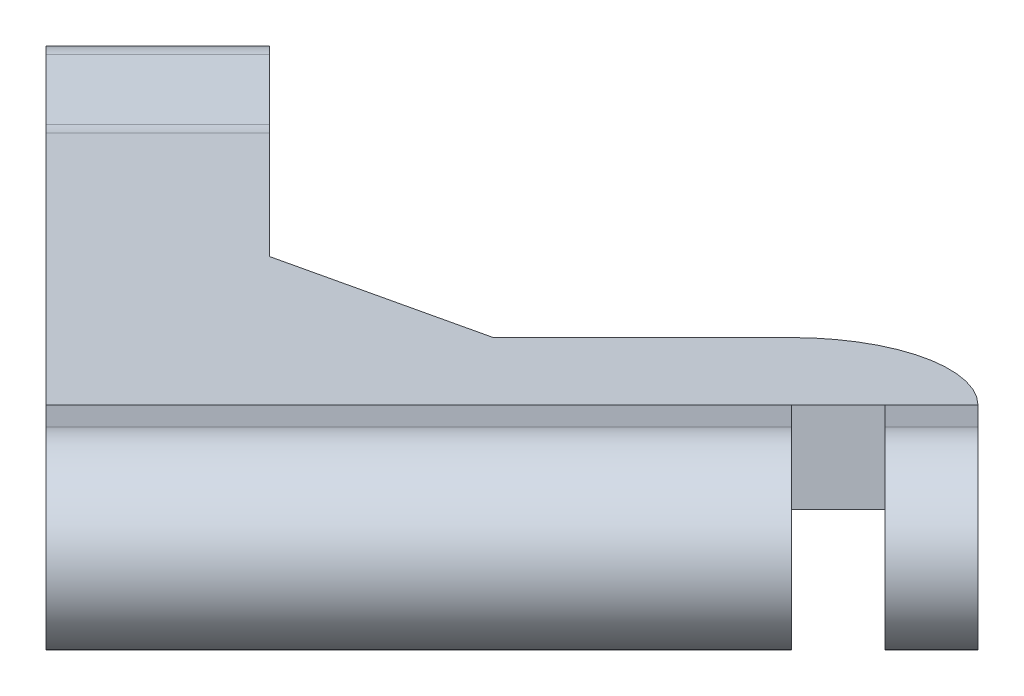
ISO-10303-21;
HEADER;
FILE_DESCRIPTION(('STEP AP214'),'2;1');
FILE_NAME('part.step','',(''),(''),'','','');
FILE_SCHEMA(('AUTOMOTIVE_DESIGN { 1 0 10303 214 1 1 1 1 }'));
ENDSEC;
DATA;
#1=APPLICATION_CONTEXT('core data for automotive mechanical design processes');
#2=APPLICATION_PROTOCOL_DEFINITION('international standard','automotive_design',2000,#1);
#3=PRODUCT_CONTEXT('',#1,'mechanical');
#4=PRODUCT('Part','Part','',(#3));
#5=PRODUCT_RELATED_PRODUCT_CATEGORY('part','',(#4));
#6=PRODUCT_DEFINITION_FORMATION('','',#4);
#7=PRODUCT_DEFINITION_CONTEXT('part definition',#1,'design');
#8=PRODUCT_DEFINITION('design','',#6,#7);
#9=PRODUCT_DEFINITION_SHAPE('','',#8);
#10=(LENGTH_UNIT() NAMED_UNIT(*) SI_UNIT(.MILLI.,.METRE.));
#11=(NAMED_UNIT(*) PLANE_ANGLE_UNIT() SI_UNIT($,.RADIAN.));
#12=(NAMED_UNIT(*) SI_UNIT($,.STERADIAN.) SOLID_ANGLE_UNIT());
#13=UNCERTAINTY_MEASURE_WITH_UNIT(LENGTH_MEASURE(1.E-05),#10,'distance_accuracy_value','');
#14=(GEOMETRIC_REPRESENTATION_CONTEXT(3) GLOBAL_UNCERTAINTY_ASSIGNED_CONTEXT((#13)) GLOBAL_UNIT_ASSIGNED_CONTEXT((#10,
#11,#12)) REPRESENTATION_CONTEXT('',''));
#15=CARTESIAN_POINT('',(0.,0.,0.));
#16=DIRECTION('',(0.,0.,1.));
#17=DIRECTION('',(1.,0.,0.));
#18=AXIS2_PLACEMENT_3D('',#15,#16,#17);
#19=CARTESIAN_POINT('',(7.47352792181047,9.75,60.017683798911));
#20=DIRECTION('',(0.707106781186551,0.,-0.707106781186544));
#21=DIRECTION('',(-0.707106781186544,0.,-0.707106781186551));
#22=AXIS2_PLACEMENT_3D('',#19,#20,#21);
#23=PLANE('',#22);
#24=CARTESIAN_POINT('',(7.47352792181047,9.75,60.017683798911));
#25=DIRECTION('',(0.707106781186551,0.,-0.707106781186544));
#26=DIRECTION('',(-0.707106781186544,0.,-0.707106781186551));
#27=AXIS2_PLACEMENT_3D('',#24,#25,#26);
#28=CIRCLE('',#27,1.);
#29=CARTESIAN_POINT('',(6.76642114062393,9.75,59.3105770177244));
#30=VERTEX_POINT('',#29);
#31=EDGE_CURVE('E277',#30,#30,#28,.T.);
#32=ORIENTED_EDGE('',*,*,#31,.F.);
#33=EDGE_LOOP('',(#32));
#34=FACE_BOUND('',#33,.T.);
#35=DIRECTION('',(0.70700675028775,-0.0168199314832323,0.707006750287757));
#36=VECTOR('',#35,1.);
#37=CARTESIAN_POINT('',(-26.1822663292059,7.55025835734501,26.3618895480781));
#38=LINE('',#37,#36);
#39=CARTESIAN_POINT('',(3.61958859566675,6.84126207448712,56.1637444727672));
#40=VERTEX_POINT('',#39);
#41=CARTESIAN_POINT('',(7.43784745899505,6.75042439516078,59.9820033360956));
#42=VERTEX_POINT('',#41);
#43=EDGE_CURVE('E274',#40,#42,#38,.T.);
#44=ORIENTED_EDGE('',*,*,#43,.F.);
#45=DIRECTION('',(-0.171498585142516,0.970142500145329,-0.171498585142518));
#46=VECTOR('',#45,1.);
#47=CARTESIAN_POINT('',(3.36234071795176,8.29647582471199,55.9064965950522));
#48=LINE('',#47,#46);
#49=CARTESIAN_POINT('',(3.1050928401906,9.75168957493467,55.6492487174748));
#50=VERTEX_POINT('',#49);
#51=EDGE_CURVE('E285',#40,#50,#48,.T.);
#52=ORIENTED_EDGE('',*,*,#51,.T.);
#53=DIRECTION('',(0.618232550201715,0.485362779518743,0.618232550201721));
#54=VECTOR('',#53,1.);
#55=CARTESIAN_POINT('',(-22.2776522712156,-10.1758275301328,30.2665036060684));
#56=LINE('',#55,#54);
#57=CARTESIAN_POINT('',(6.44391798351243,12.3729385716022,58.9880738607967));
#58=VERTEX_POINT('',#57);
#59=EDGE_CURVE('E267',#50,#58,#56,.T.);
#60=ORIENTED_EDGE('',*,*,#59,.T.);
#61=CARTESIAN_POINT('',(7.47352792181047,9.75,60.017683798911));
#62=DIRECTION('',(0.707106781186551,0.,-0.707106781186544));
#63=DIRECTION('',(-0.707106781186544,0.,-0.707106781186551));
#64=AXIS2_PLACEMENT_3D('',#61,#62,#63);
#65=CIRCLE('',#64,3.);
#66=EDGE_CURVE('E271',#58,#42,#65,.T.);
#67=ORIENTED_EDGE('',*,*,#66,.T.);
#68=EDGE_LOOP('',(#44,#52,#60,#67));
#69=FACE_BOUND('',#68,.T.);
#70=ADVANCED_FACE('F41',(#34,#69),#23,.T.);
#71=CARTESIAN_POINT('',(-36.1715728752538,0.,36.1715728752534));
#72=DIRECTION('',(0.707106781186551,0.,-0.707106781186544));
#73=DIRECTION('',(-0.707106781186544,0.,-0.707106781186551));
#74=AXIS2_PLACEMENT_3D('',#71,#72,#73);
#75=PLANE('',#74);
#76=CARTESIAN_POINT('',(-23.6391704504667,2.25,48.7039753000407));
#77=DIRECTION('',(0.707106781186551,0.,-0.707106781186544));
#78=DIRECTION('',(-0.707106781186544,0.,-0.707106781186551));
#79=AXIS2_PLACEMENT_3D('',#76,#77,#78);
#80=CIRCLE('',#79,1.);
#81=CARTESIAN_POINT('',(-24.3462772316533,2.25,47.9968685188541));
#82=VERTEX_POINT('',#81);
#83=EDGE_CURVE('E262',#82,#82,#80,.T.);
#84=ORIENTED_EDGE('',*,*,#83,.F.);
#85=EDGE_LOOP('',(#84));
#86=FACE_BOUND('',#85,.T.);
#87=DIRECTION('',(-0.685994340570032,-0.242535625036333,-0.685994340570039));
#88=VECTOR('',#87,1.);
#89=CARTESIAN_POINT('',(-36.0659712591965,-0.597372950547049,36.2771744913108));
#90=LINE('',#89,#88);
#91=CARTESIAN_POINT('',(-14.3403398426737,7.08379769954436,58.0028059078338));
#92=VERTEX_POINT('',#91);
#93=CARTESIAN_POINT('',(-20.615798453103,4.86508803029933,51.7273472974044));
#94=VERTEX_POINT('',#93);
#95=EDGE_CURVE('E251',#92,#94,#90,.T.);
#96=ORIENTED_EDGE('',*,*,#95,.F.);
#97=DIRECTION('',(0.171498585142508,-0.970142500145332,0.17149858514251));
#98=VECTOR('',#97,1.);
#99=CARTESIAN_POINT('',(-14.445941458731,7.68117065009143,57.8972042917764));
#100=LINE('',#99,#98);
#101=CARTESIAN_POINT('',(-13.8258440872462,4.17337019910837,58.5173016632613));
#102=VERTEX_POINT('',#101);
#103=EDGE_CURVE('E187',#92,#102,#100,.T.);
#104=ORIENTED_EDGE('',*,*,#103,.T.);
#105=DIRECTION('',(-0.685994340570032,-0.242535625036333,-0.685994340570039));
#106=VECTOR('',#105,1.);
#107=CARTESIAN_POINT('',(-35.551475503769,-3.50780045098305,36.7916702467383));
#108=LINE('',#107,#106);
#109=CARTESIAN_POINT('',(-20.8107433257205,1.70383539039338,51.5324024247869));
#110=VERTEX_POINT('',#109);
#111=EDGE_CURVE('E249',#102,#110,#108,.T.);
#112=ORIENTED_EDGE('',*,*,#111,.T.);
#113=DIRECTION('',(-0.655981688195146,-0.373331018675496,-0.655981688195153));
#114=VECTOR('',#113,1.);
#115=CARTESIAN_POINT('',(-34.4479075463554,-6.05732090703683,37.8952382041519));
#116=LINE('',#115,#114);
#117=CARTESIAN_POINT('',(-23.1112006606012,0.394603599772046,49.2319450899061));
#118=VERTEX_POINT('',#117);
#119=EDGE_CURVE('E246',#110,#118,#116,.T.);
#120=ORIENTED_EDGE('',*,*,#119,.T.);
#121=CARTESIAN_POINT('',(-23.6391704504667,2.25,48.7039753000407));
#122=DIRECTION('',(0.707106781186551,0.,-0.707106781186544));
#123=DIRECTION('',(-0.707106781186544,0.,-0.707106781186551));
#124=AXIS2_PLACEMENT_3D('',#121,#122,#123);
#125=CIRCLE('',#124,2.);
#126=CARTESIAN_POINT('',(-23.8245050536997,4.23275116181758,48.5186406968077));
#127=VERTEX_POINT('',#126);
#128=EDGE_CURVE('E259',#118,#127,#125,.T.);
#129=ORIENTED_EDGE('',*,*,#128,.T.);
#130=DIRECTION('',(-0.701008395963355,-0.131051354734543,-0.701008395963362));
#131=VECTOR('',#130,1.);
#132=CARTESIAN_POINT('',(-36.3483734896303,1.89145263458614,35.994772260877));
#133=LINE('',#132,#131);
#134=CARTESIAN_POINT('',(-21.0099548707332,4.75892262648203,51.3331908797743));
#135=VERTEX_POINT('',#134);
#136=EDGE_CURVE('E256',#135,#127,#133,.T.);
#137=ORIENTED_EDGE('',*,*,#136,.F.);
#138=CARTESIAN_POINT('',(-21.4732913788155,9.71580053102599,50.8698543716919));
#139=DIRECTION('',(0.707106781186551,0.,-0.707106781186544));
#140=DIRECTION('',(-0.707106781186544,0.,-0.707106781186551));
#141=AXIS2_PLACEMENT_3D('',#138,#139,#140);
#142=CIRCLE('',#141,5.);
#143=EDGE_CURVE('E253',#94,#135,#142,.T.);
#144=ORIENTED_EDGE('',*,*,#143,.F.);
#145=EDGE_LOOP('',(#96,#104,#112,#120,#129,#137,#144));
#146=FACE_BOUND('',#145,.T.);
#147=ADVANCED_FACE('F328',(#86,#146),#75,.T.);
#148=CARTESIAN_POINT('',(-27.881811137586,2.25,52.94661598716));
#149=DIRECTION('',(0.707106781186551,0.,-0.707106781186544));
#150=DIRECTION('',(-0.707106781186544,0.,-0.707106781186551));
#151=AXIS2_PLACEMENT_3D('',#148,#149,#150);
#152=CYLINDRICAL_SURFACE('',#151,2.);
#153=DIRECTION('',(0.707106781186551,0.,-0.707106781186544));
#154=VECTOR('',#153,1.);
#155=CARTESIAN_POINT('',(-28.067145740819,4.23275116181758,52.761281383927));
#156=LINE('',#155,#154);
#157=CARTESIAN_POINT('',(-28.067145740819,4.23275116181758,52.761281383927));
#158=VERTEX_POINT('',#157);
#159=EDGE_CURVE('E193',#158,#127,#156,.T.);
#160=ORIENTED_EDGE('',*,*,#159,.T.);
#161=ORIENTED_EDGE('',*,*,#128,.F.);
#162=DIRECTION('',(0.707106781186551,0.,-0.707106781186544));
#163=VECTOR('',#162,1.);
#164=CARTESIAN_POINT('',(-27.3538413477206,0.394603599772046,53.4745857770254));
#165=LINE('',#164,#163);
#166=CARTESIAN_POINT('',(-27.3538413477206,0.394603599772046,53.4745857770254));
#167=VERTEX_POINT('',#166);
#168=EDGE_CURVE('E192',#167,#118,#165,.T.);
#169=ORIENTED_EDGE('',*,*,#168,.F.);
#170=CARTESIAN_POINT('',(-27.881811137586,2.25,52.94661598716));
#171=DIRECTION('',(0.707106781186551,0.,-0.707106781186544));
#172=DIRECTION('',(-0.707106781186544,0.,-0.707106781186551));
#173=AXIS2_PLACEMENT_3D('',#170,#171,#172);
#174=CIRCLE('',#173,2.);
#175=EDGE_CURVE('E237',#167,#158,#174,.T.);
#176=ORIENTED_EDGE('',*,*,#175,.T.);
#177=EDGE_LOOP('',(#160,#161,#169,#176));
#178=FACE_BOUND('',#177,.T.);
#179=ADVANCED_FACE('F334',(#178),#152,.T.);
#180=CARTESIAN_POINT('',(-38.6905482334747,-6.05732090703683,42.1378788912711));
#181=DIRECTION('',(0.263984894932724,-0.927698200113979,0.263984894932726));
#182=DIRECTION('',(0.,-0.273693681767347,-0.961816910103287));
#183=AXIS2_PLACEMENT_3D('',#180,#181,#182);
#184=PLANE('',#183);
#185=ORIENTED_EDGE('',*,*,#168,.T.);
#186=ORIENTED_EDGE('',*,*,#119,.F.);
#187=DIRECTION('',(0.707106781186551,0.,-0.707106781186544));
#188=VECTOR('',#187,1.);
#189=CARTESIAN_POINT('',(-25.0533840128398,1.70383539039338,55.7750431119062));
#190=LINE('',#189,#188);
#191=CARTESIAN_POINT('',(-25.0533840128398,1.70383539039338,55.7750431119062));
#192=VERTEX_POINT('',#191);
#193=EDGE_CURVE('E211',#192,#110,#190,.T.);
#194=ORIENTED_EDGE('',*,*,#193,.F.);
#195=DIRECTION('',(-0.655981688195146,-0.373331018675496,-0.655981688195153));
#196=VECTOR('',#195,1.);
#197=CARTESIAN_POINT('',(-38.6905482334747,-6.05732090703683,42.1378788912711));
#198=LINE('',#197,#196);
#199=EDGE_CURVE('E196',#192,#167,#198,.T.);
#200=ORIENTED_EDGE('',*,*,#199,.T.);
#201=EDGE_LOOP('',(#185,#186,#194,#200));
#202=FACE_BOUND('',#201,.T.);
#203=ADVANCED_FACE('F348',(#202),#184,.T.);
#204=CARTESIAN_POINT('',(-39.7941161908883,-3.50780045098305,41.0343109338575));
#205=DIRECTION('',(0.171498585142508,-0.970142500145332,0.17149858514251));
#206=DIRECTION('',(0.,-0.174077655955699,-0.984731927834662));
#207=AXIS2_PLACEMENT_3D('',#204,#205,#206);
#208=PLANE('',#207);
#209=DIRECTION('',(-0.707106781186551,0.,0.707106781186544));
#210=VECTOR('',#209,1.);
#211=CARTESIAN_POINT('',(0.189616892783837,5.62858394933716,52.733772770068));
#212=LINE('',#211,#210);
#213=CARTESIAN_POINT('',(0.189616892854035,5.62858394933716,52.7337727699978));
#214=VERTEX_POINT('',#213);
#215=CARTESIAN_POINT('',(-5.46723735670858,5.62858394933716,58.3906270195604));
#216=VERTEX_POINT('',#215);
#217=EDGE_CURVE('E157',#214,#216,#212,.T.);
#218=ORIENTED_EDGE('',*,*,#217,.F.);
#219=CARTESIAN_POINT('',(3.6195885957061,6.84126207450804,56.1637444728499));
#220=DIRECTION('',(0.171498585142508,-0.970142500145332,0.17149858514251));
#221=DIRECTION('',(0.,-0.174077655955699,-0.984731927834662));
#222=AXIS2_PLACEMENT_3D('',#219,#220,#221);
#223=CIRCLE('',#222,5.);
#224=CARTESIAN_POINT('',(7.15512250156929,6.84126207448983,52.6282105668043));
#225=VERTEX_POINT('',#224);
#226=EDGE_CURVE('E11',#214,#225,#223,.T.);
#227=ORIENTED_EDGE('',*,*,#226,.T.);
#228=DIRECTION('',(-0.707106781186551,0.,0.707106781186544));
#229=VECTOR('',#228,1.);
#230=CARTESIAN_POINT('',(7.15512250156929,6.84126207448983,52.6282105668043));
#231=LINE('',#230,#229);
#232=CARTESIAN_POINT('',(5.38735554863312,6.84126207448712,54.3959775198009));
#233=VERTEX_POINT('',#232);
#234=EDGE_CURVE('E154',#225,#233,#231,.T.);
#235=ORIENTED_EDGE('',*,*,#234,.T.);
#236=DIRECTION('',(-0.707106781186551,0.,0.707106781186544));
#237=VECTOR('',#236,1.);
#238=CARTESIAN_POINT('',(5.38735554863312,6.84126207448712,54.3959775198009));
#239=LINE('',#238,#237);
#240=EDGE_CURVE('E280',#233,#40,#239,.T.);
#241=ORIENTED_EDGE('',*,*,#240,.T.);
#242=DIRECTION('',(0.707106781186551,0.,-0.707106781186544));
#243=VECTOR('',#242,1.);
#244=CARTESIAN_POINT('',(-10.5225470281446,6.84126207449054,70.3058800966015));
#245=LINE('',#244,#243);
#246=CARTESIAN_POINT('',(-10.5225470281446,6.84126207449054,70.3058800966015));
#247=VERTEX_POINT('',#246);
#248=EDGE_CURVE('E208',#247,#40,#245,.T.);
#249=ORIENTED_EDGE('',*,*,#248,.F.);
#250=DIRECTION('',(-0.685994340570032,-0.242535625036333,-0.685994340570039));
#251=VECTOR('',#250,1.);
#252=CARTESIAN_POINT('',(-39.7941161908883,-3.50780045098305,41.0343109338575));
#253=LINE('',#252,#251);
#254=EDGE_CURVE('E217',#247,#192,#253,.T.);
#255=ORIENTED_EDGE('',*,*,#254,.T.);
#256=ORIENTED_EDGE('',*,*,#193,.T.);
#257=ORIENTED_EDGE('',*,*,#111,.F.);
#258=DIRECTION('',(0.985071250072666,0.17149858514251,-0.0149287499273242));
#259=VECTOR('',#258,1.);
#260=CARTESIAN_POINT('',(-5.46723735670668,5.62858394932638,58.3906270195623));
#261=LINE('',#260,#259);
#262=EDGE_CURVE('E180',#102,#216,#261,.T.);
#263=ORIENTED_EDGE('',*,*,#262,.T.);
#264=EDGE_LOOP('',(#218,#227,#235,#241,#249,#255,#256,#257,#263));
#265=FACE_BOUND('',#264,.T.);
#266=ADVANCED_FACE('F153',(#265),#208,.T.);
#267=CARTESIAN_POINT('',(-40.3244019529369,7.55025835734671,40.504025171809));
#268=DIRECTION('',(-0.0118934876108866,-0.999858534946269,-0.0118934876108867));
#269=DIRECTION('',(0.,0.0118943288970687,-0.999929259967968));
#270=AXIS2_PLACEMENT_3D('',#267,#268,#269);
#271=PLANE('',#270);
#272=ORIENTED_EDGE('',*,*,#248,.T.);
#273=ORIENTED_EDGE('',*,*,#43,.T.);
#274=DIRECTION('',(0.707106781186551,0.,-0.707106781186544));
#275=VECTOR('',#274,1.);
#276=CARTESIAN_POINT('',(-6.70428816482242,6.7504243951612,74.1241389599238));
#277=LINE('',#276,#275);
#278=CARTESIAN_POINT('',(-6.70428816482242,6.7504243951612,74.1241389599238));
#279=VERTEX_POINT('',#278);
#280=EDGE_CURVE('E206',#279,#42,#277,.T.);
#281=ORIENTED_EDGE('',*,*,#280,.F.);
#282=DIRECTION('',(-0.70700675028775,0.0168199314832323,-0.707006750287757));
#283=VECTOR('',#282,1.);
#284=CARTESIAN_POINT('',(-40.3244019529369,7.55025835734671,40.504025171809));
#285=LINE('',#284,#283);
#286=EDGE_CURVE('E220',#279,#247,#285,.T.);
#287=ORIENTED_EDGE('',*,*,#286,.T.);
#288=EDGE_LOOP('',(#272,#273,#281,#287));
#289=FACE_BOUND('',#288,.T.);
#290=ADVANCED_FACE('F354',(#289),#271,.T.);
#291=CARTESIAN_POINT('',(-6.66860770198968,9.75,74.1598194227565));
#292=DIRECTION('',(0.707106781186551,0.,-0.707106781186544));
#293=DIRECTION('',(-0.707106781186544,0.,-0.707106781186551));
#294=AXIS2_PLACEMENT_3D('',#291,#292,#293);
#295=CYLINDRICAL_SURFACE('',#294,3.);
#296=ORIENTED_EDGE('',*,*,#280,.T.);
#297=ORIENTED_EDGE('',*,*,#66,.F.);
#298=DIRECTION('',(0.707106781186551,0.,-0.707106781186544));
#299=VECTOR('',#298,1.);
#300=CARTESIAN_POINT('',(-7.69821764018945,12.3729385715873,73.1302094845567));
#301=LINE('',#300,#299);
#302=CARTESIAN_POINT('',(-7.69821764018945,12.3729385715873,73.1302094845567));
#303=VERTEX_POINT('',#302);
#304=EDGE_CURVE('E204',#303,#58,#301,.T.);
#305=ORIENTED_EDGE('',*,*,#304,.F.);
#306=CARTESIAN_POINT('',(-6.66860770198968,9.75,74.1598194227565));
#307=DIRECTION('',(0.707106781186551,0.,-0.707106781186544));
#308=DIRECTION('',(-0.707106781186544,0.,-0.707106781186551));
#309=AXIS2_PLACEMENT_3D('',#306,#307,#308);
#310=CIRCLE('',#309,3.);
#311=EDGE_CURVE('E223',#303,#279,#310,.T.);
#312=ORIENTED_EDGE('',*,*,#311,.T.);
#313=EDGE_LOOP('',(#296,#297,#305,#312));
#314=FACE_BOUND('',#313,.T.);
#315=ADVANCED_FACE('F357',(#314),#295,.T.);
#316=CARTESIAN_POINT('',(-36.4197878949353,-10.1758275301617,44.4086392298106));
#317=DIRECTION('',(0.343203312733252,-0.874312857195775,0.343203312733256));
#318=DIRECTION('',(0.,-0.365397117689668,-0.930851731686676));
#319=AXIS2_PLACEMENT_3D('',#316,#317,#318);
#320=PLANE('',#319);
#321=ORIENTED_EDGE('',*,*,#304,.T.);
#322=ORIENTED_EDGE('',*,*,#59,.F.);
#323=DIRECTION('',(0.707106781186551,0.,-0.707106781186544));
#324=VECTOR('',#323,1.);
#325=CARTESIAN_POINT('',(-11.0370427835722,9.75168957492653,69.791384341174));
#326=LINE('',#325,#324);
#327=CARTESIAN_POINT('',(-11.0370427835722,9.75168957492653,69.791384341174));
#328=VERTEX_POINT('',#327);
#329=EDGE_CURVE('E201',#328,#50,#326,.T.);
#330=ORIENTED_EDGE('',*,*,#329,.F.);
#331=DIRECTION('',(-0.618232550201715,-0.485362779518743,-0.618232550201722));
#332=VECTOR('',#331,1.);
#333=CARTESIAN_POINT('',(-36.4197878949353,-10.1758275301617,44.4086392298106));
#334=LINE('',#333,#332);
#335=EDGE_CURVE('E226',#303,#328,#334,.T.);
#336=ORIENTED_EDGE('',*,*,#335,.F.);
#337=EDGE_LOOP('',(#321,#322,#330,#336));
#338=FACE_BOUND('',#337,.T.);
#339=ADVANCED_FACE('F361',(#338),#320,.F.);
#340=CARTESIAN_POINT('',(-40.3086119463158,-0.597372950547049,40.51981517843));
#341=DIRECTION('',(0.171498585142508,-0.970142500145332,0.17149858514251));
#342=DIRECTION('',(0.,-0.174077655955699,-0.984731927834662));
#343=AXIS2_PLACEMENT_3D('',#340,#341,#342);
#344=PLANE('',#343);
#345=DIRECTION('',(-0.707106781186551,0.,0.707106781186544));
#346=VECTOR('',#345,1.);
#347=CARTESIAN_POINT('',(6.64062674622021,9.75168957495108,52.1137148114552));
#348=LINE('',#347,#346);
#349=CARTESIAN_POINT('',(6.64062674622021,9.75168957495108,52.1137148114552));
#350=VERTEX_POINT('',#349);
#351=CARTESIAN_POINT('',(4.87285979325383,9.75168957495108,53.8814817644216));
#352=VERTEX_POINT('',#351);
#353=EDGE_CURVE('E288',#350,#352,#348,.T.);
#354=ORIENTED_EDGE('',*,*,#353,.F.);
#355=CARTESIAN_POINT('',(3.10509284027858,9.75168957494404,55.6492487174224));
#356=DIRECTION('',(0.171498585142508,-0.970142500145332,0.17149858514251));
#357=DIRECTION('',(0.,-0.174077655955699,-0.984731927834662));
#358=AXIS2_PLACEMENT_3D('',#355,#356,#357);
#359=CIRCLE('',#358,5.);
#360=CARTESIAN_POINT('',(-0.324878862571073,8.53901144975948,52.2192770145727));
#361=VERTEX_POINT('',#360);
#362=EDGE_CURVE('E63',#350,#361,#359,.F.);
#363=ORIENTED_EDGE('',*,*,#362,.T.);
#364=DIRECTION('',(-0.707106781186551,0.,0.707106781186544));
#365=VECTOR('',#364,1.);
#366=CARTESIAN_POINT('',(-0.324878862641268,8.53901144975948,52.2192770146429));
#367=LINE('',#366,#365);
#368=CARTESIAN_POINT('',(-5.98173311213369,8.53901144975948,57.8761312641353));
#369=VERTEX_POINT('',#368);
#370=EDGE_CURVE('E265',#361,#369,#367,.T.);
#371=ORIENTED_EDGE('',*,*,#370,.T.);
#372=DIRECTION('',(-0.985071250072666,-0.17149858514251,0.0149287499273242));
#373=VECTOR('',#372,1.);
#374=CARTESIAN_POINT('',(-40.5795930554002,2.51560549938962,58.4004616606168));
#375=LINE('',#374,#373);
#376=EDGE_CURVE('E183',#369,#92,#375,.T.);
#377=ORIENTED_EDGE('',*,*,#376,.T.);
#378=ORIENTED_EDGE('',*,*,#95,.T.);
#379=DIRECTION('',(0.707106781186551,0.,-0.707106781186544));
#380=VECTOR('',#379,1.);
#381=CARTESIAN_POINT('',(-24.8584391402223,4.86508803029933,55.9699879845237));
#382=LINE('',#381,#380);
#383=CARTESIAN_POINT('',(-24.8584391402223,4.86508803029933,55.9699879845237));
#384=VERTEX_POINT('',#383);
#385=EDGE_CURVE('E198',#384,#94,#382,.T.);
#386=ORIENTED_EDGE('',*,*,#385,.F.);
#387=DIRECTION('',(-0.685994340570032,-0.242535625036333,-0.685994340570039));
#388=VECTOR('',#387,1.);
#389=CARTESIAN_POINT('',(-40.3086119463158,-0.597372950547049,40.51981517843));
#390=LINE('',#389,#388);
#391=EDGE_CURVE('E229',#328,#384,#390,.T.);
#392=ORIENTED_EDGE('',*,*,#391,.F.);
#393=ORIENTED_EDGE('',*,*,#329,.T.);
#394=DIRECTION('',(-0.707106781186551,0.,0.707106781186544));
#395=VECTOR('',#394,1.);
#396=CARTESIAN_POINT('',(4.87285979320068,9.75168957495079,53.8814817643684));
#397=LINE('',#396,#395);
#398=EDGE_CURVE('E281',#352,#50,#397,.T.);
#399=ORIENTED_EDGE('',*,*,#398,.F.);
#400=EDGE_LOOP('',(#354,#363,#371,#377,#378,#386,#392,#393,#399));
#401=FACE_BOUND('',#400,.T.);
#402=ADVANCED_FACE('F365',(#401),#344,.F.);
#403=CARTESIAN_POINT('',(-25.7159320659349,9.71580053102599,55.1124950588111));
#404=DIRECTION('',(0.707106781186551,0.,-0.707106781186544));
#405=DIRECTION('',(-0.707106781186544,0.,-0.707106781186551));
#406=AXIS2_PLACEMENT_3D('',#403,#404,#405);
#407=CYLINDRICAL_SURFACE('',#406,5.);
#408=ORIENTED_EDGE('',*,*,#385,.T.);
#409=ORIENTED_EDGE('',*,*,#143,.T.);
#410=DIRECTION('',(0.707106781186551,0.,-0.707106781186544));
#411=VECTOR('',#410,1.);
#412=CARTESIAN_POINT('',(-25.2525955578525,4.75892262648203,55.5758315668935));
#413=LINE('',#412,#411);
#414=CARTESIAN_POINT('',(-25.2525955578525,4.75892262648203,55.5758315668935));
#415=VERTEX_POINT('',#414);
#416=EDGE_CURVE('E195',#415,#135,#413,.T.);
#417=ORIENTED_EDGE('',*,*,#416,.F.);
#418=CARTESIAN_POINT('',(-25.7159320659349,9.71580053102599,55.1124950588111));
#419=DIRECTION('',(0.707106781186551,0.,-0.707106781186544));
#420=DIRECTION('',(-0.707106781186544,0.,-0.707106781186551));
#421=AXIS2_PLACEMENT_3D('',#418,#419,#420);
#422=CIRCLE('',#421,5.);
#423=EDGE_CURVE('E232',#384,#415,#422,.T.);
#424=ORIENTED_EDGE('',*,*,#423,.F.);
#425=EDGE_LOOP('',(#408,#409,#417,#424));
#426=FACE_BOUND('',#425,.T.);
#427=ADVANCED_FACE('F369',(#426),#407,.F.);
#428=CARTESIAN_POINT('',(-27.881811137586,2.25,52.9466159871599));
#429=DIRECTION('',(0.707106781186551,0.,-0.707106781186544));
#430=DIRECTION('',(-0.707106781186544,0.,-0.707106781186551));
#431=AXIS2_PLACEMENT_3D('',#428,#429,#430);
#432=CYLINDRICAL_SURFACE('',#431,1.);
#433=CARTESIAN_POINT('',(-27.881811137586,2.25,52.9466159871599));
#434=DIRECTION('',(0.707106781186551,0.,-0.707106781186544));
#435=DIRECTION('',(-0.707106781186544,0.,-0.707106781186551));
#436=AXIS2_PLACEMENT_3D('',#433,#434,#435);
#437=CIRCLE('',#436,1.);
#438=CARTESIAN_POINT('',(-28.5889179187726,2.25,52.2395092059734));
#439=VERTEX_POINT('',#438);
#440=EDGE_CURVE('E240',#439,#439,#437,.T.);
#441=ORIENTED_EDGE('',*,*,#440,.F.);
#442=EDGE_LOOP('',(#441));
#443=FACE_BOUND('',#442,.T.);
#444=ORIENTED_EDGE('',*,*,#83,.T.);
#445=EDGE_LOOP('',(#444));
#446=FACE_BOUND('',#445,.T.);
#447=ADVANCED_FACE('F372',(#443,#446),#432,.F.);
#448=CARTESIAN_POINT('',(-6.66860770198968,9.75,74.1598194227565));
#449=DIRECTION('',(0.707106781186551,0.,-0.707106781186544));
#450=DIRECTION('',(-0.707106781186544,0.,-0.707106781186551));
#451=AXIS2_PLACEMENT_3D('',#448,#449,#450);
#452=CYLINDRICAL_SURFACE('',#451,1.);
#453=CARTESIAN_POINT('',(-6.66860770198968,9.75,74.1598194227565));
#454=DIRECTION('',(0.707106781186551,0.,-0.707106781186544));
#455=DIRECTION('',(-0.707106781186544,0.,-0.707106781186551));
#456=AXIS2_PLACEMENT_3D('',#453,#454,#455);
#457=CIRCLE('',#456,1.);
#458=CARTESIAN_POINT('',(-7.37571448317623,9.75,73.45271264157));
#459=VERTEX_POINT('',#458);
#460=EDGE_CURVE('E243',#459,#459,#457,.T.);
#461=ORIENTED_EDGE('',*,*,#460,.F.);
#462=EDGE_LOOP('',(#461));
#463=FACE_BOUND('',#462,.T.);
#464=ORIENTED_EDGE('',*,*,#31,.T.);
#465=EDGE_LOOP('',(#464));
#466=FACE_BOUND('',#465,.T.);
#467=ADVANCED_FACE('F376',(#463,#466),#452,.F.);
#468=CARTESIAN_POINT('',(-40.5910141767496,1.89145263458614,40.2374129479963));
#469=DIRECTION('',(0.0926673016164783,-0.99137558090879,0.0926673016164793));
#470=DIRECTION('',(0.,-0.0930677602526339,-0.99565977723395));
#471=AXIS2_PLACEMENT_3D('',#468,#469,#470);
#472=PLANE('',#471);
#473=ORIENTED_EDGE('',*,*,#416,.T.);
#474=ORIENTED_EDGE('',*,*,#136,.T.);
#475=ORIENTED_EDGE('',*,*,#159,.F.);
#476=DIRECTION('',(-0.701008395963355,-0.131051354734543,-0.701008395963362));
#477=VECTOR('',#476,1.);
#478=CARTESIAN_POINT('',(-40.5910141767496,1.89145263458614,40.2374129479963));
#479=LINE('',#478,#477);
#480=EDGE_CURVE('E235',#415,#158,#479,.T.);
#481=ORIENTED_EDGE('',*,*,#480,.F.);
#482=EDGE_LOOP('',(#473,#474,#475,#481));
#483=FACE_BOUND('',#482,.T.);
#484=ADVANCED_FACE('F346',(#483),#472,.F.);
#485=CARTESIAN_POINT('',(-40.4142135623731,0.,40.4142135623727));
#486=DIRECTION('',(0.707106781186551,0.,-0.707106781186544));
#487=DIRECTION('',(-0.707106781186544,0.,-0.707106781186551));
#488=AXIS2_PLACEMENT_3D('',#485,#486,#487);
#489=PLANE('',#488);
#490=ORIENTED_EDGE('',*,*,#460,.T.);
#491=EDGE_LOOP('',(#490));
#492=FACE_BOUND('',#491,.T.);
#493=ORIENTED_EDGE('',*,*,#440,.T.);
#494=EDGE_LOOP('',(#493));
#495=FACE_BOUND('',#494,.T.);
#496=ORIENTED_EDGE('',*,*,#175,.F.);
#497=ORIENTED_EDGE('',*,*,#199,.F.);
#498=ORIENTED_EDGE('',*,*,#254,.F.);
#499=ORIENTED_EDGE('',*,*,#286,.F.);
#500=ORIENTED_EDGE('',*,*,#311,.F.);
#501=ORIENTED_EDGE('',*,*,#335,.T.);
#502=ORIENTED_EDGE('',*,*,#391,.T.);
#503=ORIENTED_EDGE('',*,*,#423,.T.);
#504=ORIENTED_EDGE('',*,*,#480,.T.);
#505=EDGE_LOOP('',(#496,#497,#498,#499,#500,#501,#502,#503,#504));
#506=FACE_BOUND('',#505,.T.);
#507=ADVANCED_FACE('F342',(#492,#495,#506),#489,.F.);
#508=CARTESIAN_POINT('',(-0.430480478699091,9.13638440030944,52.1136753985851));
#509=DIRECTION('',(0.685994340570032,0.242535625036333,0.685994340570039));
#510=DIRECTION('',(0.707106781186551,0.,-0.707106781186544));
#511=AXIS2_PLACEMENT_3D('',#508,#509,#510);
#512=PLANE('',#511);
#513=ORIENTED_EDGE('',*,*,#370,.F.);
#514=DIRECTION('',(-0.171498585142508,0.970142500145332,-0.17149858514251));
#515=VECTOR('',#514,1.);
#516=CARTESIAN_POINT('',(0.189616892856469,5.62858394932338,52.7337727700003));
#517=LINE('',#516,#515);
#518=EDGE_CURVE('E49',#361,#214,#517,.F.);
#519=ORIENTED_EDGE('',*,*,#518,.T.);
#520=ORIENTED_EDGE('',*,*,#217,.T.);
#521=DIRECTION('',(-0.171498585142508,0.970142500145332,-0.17149858514251));
#522=VECTOR('',#521,1.);
#523=CARTESIAN_POINT('',(-6.08733472819151,9.13638440030944,57.7705296480775));
#524=LINE('',#523,#522);
#525=EDGE_CURVE('E189',#216,#369,#524,.T.);
#526=ORIENTED_EDGE('',*,*,#525,.T.);
#527=EDGE_LOOP('',(#513,#519,#520,#526));
#528=FACE_BOUND('',#527,.T.);
#529=ADVANCED_FACE('F323',(#528),#512,.F.);
#530=CARTESIAN_POINT('',(5.13010767091814,8.29647582471199,54.1387296420859));
#531=DIRECTION('',(0.68599434057003,0.242535625036344,0.685994340570037));
#532=DIRECTION('',(0.707106781186551,0.,-0.707106781186544));
#533=AXIS2_PLACEMENT_3D('',#530,#531,#532);
#534=PLANE('',#533);
#535=ORIENTED_EDGE('',*,*,#51,.F.);
#536=ORIENTED_EDGE('',*,*,#240,.F.);
#537=DIRECTION('',(-0.171498585142516,0.970142500145329,-0.171498585142518));
#538=VECTOR('',#537,1.);
#539=CARTESIAN_POINT('',(5.13010767091814,8.29647582471199,54.1387296420859));
#540=LINE('',#539,#538);
#541=EDGE_CURVE('E283',#233,#352,#540,.T.);
#542=ORIENTED_EDGE('',*,*,#541,.T.);
#543=ORIENTED_EDGE('',*,*,#398,.T.);
#544=EDGE_LOOP('',(#535,#536,#542,#543));
#545=FACE_BOUND('',#544,.T.);
#546=ADVANCED_FACE('F314',(#545),#534,.T.);
#547=CARTESIAN_POINT('',(11.0090618277215,9.75,56.4821498929999));
#548=DIRECTION('',(0.707106781186551,0.,-0.707106781186544));
#549=DIRECTION('',(-0.707106781186544,0.,-0.707106781186551));
#550=AXIS2_PLACEMENT_3D('',#547,#548,#549);
#551=PLANE('',#550);
#552=DIRECTION('',(0.70700675028775,-0.0168199314832323,0.707006750287757));
#553=VECTOR('',#552,1.);
#554=CARTESIAN_POINT('',(-22.6467324231812,7.55025835734501,22.8263556420535));
#555=LINE('',#554,#553);
#556=CARTESIAN_POINT('',(10.9733813648492,6.75042439516213,56.4464694301276));
#557=VERTEX_POINT('',#556);
#558=EDGE_CURVE('E164',#225,#557,#555,.T.);
#559=ORIENTED_EDGE('',*,*,#558,.F.);
#560=DIRECTION('',(-0.171498585142508,0.970142500145332,-0.17149858514251));
#561=VECTOR('',#560,1.);
#562=CARTESIAN_POINT('',(6.64062674620941,9.75168957495493,52.1137148114878));
#563=LINE('',#562,#561);
#564=EDGE_CURVE('E174',#225,#350,#563,.T.);
#565=ORIENTED_EDGE('',*,*,#564,.T.);
#566=DIRECTION('',(0.618232550201715,0.485362779518743,0.618232550201722));
#567=VECTOR('',#566,1.);
#568=CARTESIAN_POINT('',(-18.7421183651812,-10.1758275301577,26.7309697000535));
#569=LINE('',#568,#567);
#570=CARTESIAN_POINT('',(9.97945188959022,12.3729385716115,55.4525399548253));
#571=VERTEX_POINT('',#570);
#572=EDGE_CURVE('E168',#350,#571,#569,.T.);
#573=ORIENTED_EDGE('',*,*,#572,.T.);
#574=CARTESIAN_POINT('',(11.0090618277215,9.75,56.4821498929999));
#575=DIRECTION('',(0.707106781186551,0.,-0.707106781186544));
#576=DIRECTION('',(-0.707106781186544,0.,-0.707106781186551));
#577=AXIS2_PLACEMENT_3D('',#574,#575,#576);
#578=CIRCLE('',#577,3.);
#579=EDGE_CURVE('E176',#571,#557,#578,.T.);
#580=ORIENTED_EDGE('',*,*,#579,.T.);
#581=EDGE_LOOP('',(#559,#565,#573,#580));
#582=FACE_BOUND('',#581,.T.);
#583=CARTESIAN_POINT('',(11.0090618277215,9.75,56.4821498929999));
#584=DIRECTION('',(0.707106781186551,0.,-0.707106781186544));
#585=DIRECTION('',(-0.707106781186544,0.,-0.707106781186551));
#586=AXIS2_PLACEMENT_3D('',#583,#584,#585);
#587=CIRCLE('',#586,1.);
#588=CARTESIAN_POINT('',(10.3019550465349,9.75,55.7750431118133));
#589=VERTEX_POINT('',#588);
#590=EDGE_CURVE('E301',#589,#589,#587,.T.);
#591=ORIENTED_EDGE('',*,*,#590,.F.);
#592=EDGE_LOOP('',(#591));
#593=FACE_BOUND('',#592,.T.);
#594=ADVANCED_FACE('F172',(#582,#593),#551,.T.);
#595=CARTESIAN_POINT('',(9.24129487475511,9.75,58.2499168459663));
#596=DIRECTION('',(0.707106781186551,0.,-0.707106781186544));
#597=DIRECTION('',(-0.707106781186544,0.,-0.707106781186551));
#598=AXIS2_PLACEMENT_3D('',#595,#596,#597);
#599=PLANE('',#598);
#600=ORIENTED_EDGE('',*,*,#541,.F.);
#601=DIRECTION('',(0.70700675028775,-0.0168199314832323,0.707006750287757));
#602=VECTOR('',#601,1.);
#603=CARTESIAN_POINT('',(-24.4144993761476,7.55025835734501,24.5941225950198));
#604=LINE('',#603,#602);
#605=CARTESIAN_POINT('',(9.20561441188284,6.75042439516213,58.214236383094));
#606=VERTEX_POINT('',#605);
#607=EDGE_CURVE('E166',#233,#606,#604,.T.);
#608=ORIENTED_EDGE('',*,*,#607,.T.);
#609=CARTESIAN_POINT('',(9.24129487475511,9.75,58.2499168459663));
#610=DIRECTION('',(0.707106781186551,0.,-0.707106781186544));
#611=DIRECTION('',(-0.707106781186544,0.,-0.707106781186551));
#612=AXIS2_PLACEMENT_3D('',#609,#610,#611);
#613=CIRCLE('',#612,3.);
#614=CARTESIAN_POINT('',(8.21168493662384,12.3729385716115,57.2203069077916));
#615=VERTEX_POINT('',#614);
#616=EDGE_CURVE('E297',#615,#606,#613,.T.);
#617=ORIENTED_EDGE('',*,*,#616,.F.);
#618=DIRECTION('',(0.618232550201715,0.485362779518743,0.618232550201722));
#619=VECTOR('',#618,1.);
#620=CARTESIAN_POINT('',(-20.5098853181476,-10.1758275301577,28.4987366530199));
#621=LINE('',#620,#619);
#622=EDGE_CURVE('E178',#352,#615,#621,.T.);
#623=ORIENTED_EDGE('',*,*,#622,.F.);
#624=EDGE_LOOP('',(#600,#608,#617,#623));
#625=FACE_BOUND('',#624,.T.);
#626=CARTESIAN_POINT('',(9.24129487475511,9.75,58.2499168459663));
#627=DIRECTION('',(0.707106781186551,0.,-0.707106781186544));
#628=DIRECTION('',(-0.707106781186544,0.,-0.707106781186551));
#629=AXIS2_PLACEMENT_3D('',#626,#627,#628);
#630=CIRCLE('',#629,1.);
#631=CARTESIAN_POINT('',(8.53418809356857,9.75,57.5428100647797));
#632=VERTEX_POINT('',#631);
#633=EDGE_CURVE('E304',#632,#632,#630,.T.);
#634=ORIENTED_EDGE('',*,*,#633,.T.);
#635=EDGE_LOOP('',(#634));
#636=FACE_BOUND('',#635,.T.);
#637=ADVANCED_FACE('F313',(#625,#636),#599,.F.);
#638=CARTESIAN_POINT('',(-18.7421183651812,-10.1758275301577,26.7309697000535));
#639=DIRECTION('',(0.343203312733252,-0.874312857195775,0.343203312733256));
#640=DIRECTION('',(0.,-0.365397117689668,-0.930851731686676));
#641=AXIS2_PLACEMENT_3D('',#638,#639,#640);
#642=PLANE('',#641);
#643=ORIENTED_EDGE('',*,*,#622,.T.);
#644=DIRECTION('',(-0.707106781186551,0.,0.707106781186544));
#645=VECTOR('',#644,1.);
#646=CARTESIAN_POINT('',(9.97945188959022,12.3729385716115,55.4525399548253));
#647=LINE('',#646,#645);
#648=EDGE_CURVE('E291',#571,#615,#647,.T.);
#649=ORIENTED_EDGE('',*,*,#648,.F.);
#650=ORIENTED_EDGE('',*,*,#572,.F.);
#651=ORIENTED_EDGE('',*,*,#353,.T.);
#652=EDGE_LOOP('',(#643,#649,#650,#651));
#653=FACE_BOUND('',#652,.T.);
#654=ADVANCED_FACE('F320',(#653),#642,.F.);
#655=CARTESIAN_POINT('',(11.0090618277215,9.75,56.4821498929999));
#656=DIRECTION('',(-0.707106781186551,0.,0.707106781186544));
#657=DIRECTION('',(0.707106781186544,0.,0.707106781186551));
#658=AXIS2_PLACEMENT_3D('',#655,#656,#657);
#659=CYLINDRICAL_SURFACE('',#658,3.);
#660=ORIENTED_EDGE('',*,*,#616,.T.);
#661=DIRECTION('',(-0.707106781186551,0.,0.707106781186544));
#662=VECTOR('',#661,1.);
#663=CARTESIAN_POINT('',(10.9733813648492,6.75042439516213,56.4464694301276));
#664=LINE('',#663,#662);
#665=EDGE_CURVE('E167',#557,#606,#664,.T.);
#666=ORIENTED_EDGE('',*,*,#665,.F.);
#667=ORIENTED_EDGE('',*,*,#579,.F.);
#668=ORIENTED_EDGE('',*,*,#648,.T.);
#669=EDGE_LOOP('',(#660,#666,#667,#668));
#670=FACE_BOUND('',#669,.T.);
#671=ADVANCED_FACE('F430',(#670),#659,.T.);
#672=CARTESIAN_POINT('',(-22.6467324231812,7.55025835734501,22.8263556420535));
#673=DIRECTION('',(-0.0118934876108866,-0.999858534946269,-0.0118934876108867));
#674=DIRECTION('',(0.,0.0118943288970687,-0.999929259967968));
#675=AXIS2_PLACEMENT_3D('',#672,#673,#674);
#676=PLANE('',#675);
#677=ORIENTED_EDGE('',*,*,#607,.F.);
#678=ORIENTED_EDGE('',*,*,#234,.F.);
#679=ORIENTED_EDGE('',*,*,#558,.T.);
#680=ORIENTED_EDGE('',*,*,#665,.T.);
#681=EDGE_LOOP('',(#677,#678,#679,#680));
#682=FACE_BOUND('',#681,.T.);
#683=ADVANCED_FACE('F163',(#682),#676,.T.);
#684=CARTESIAN_POINT('',(11.0090618277215,9.75,56.4821498929999));
#685=DIRECTION('',(-0.707106781186551,0.,0.707106781186544));
#686=DIRECTION('',(0.707106781186544,0.,0.707106781186551));
#687=AXIS2_PLACEMENT_3D('',#684,#685,#686);
#688=CYLINDRICAL_SURFACE('',#687,1.);
#689=ORIENTED_EDGE('',*,*,#590,.T.);
#690=EDGE_LOOP('',(#689));
#691=FACE_BOUND('',#690,.T.);
#692=ORIENTED_EDGE('',*,*,#633,.F.);
#693=EDGE_LOOP('',(#692));
#694=FACE_BOUND('',#693,.T.);
#695=ADVANCED_FACE('F310',(#691,#694),#688,.F.);
#696=CARTESIAN_POINT('',(-6.08733472819151,9.13638440030944,57.7705296480775));
#697=DIRECTION('',(-0.0149287499273439,0.171498585142508,0.985071250072666));
#698=DIRECTION('',(-0.171498585142508,0.970142500145332,-0.17149858514251));
#699=AXIS2_PLACEMENT_3D('',#696,#697,#698);
#700=PLANE('',#699);
#701=ORIENTED_EDGE('',*,*,#262,.F.);
#702=ORIENTED_EDGE('',*,*,#103,.F.);
#703=ORIENTED_EDGE('',*,*,#376,.F.);
#704=ORIENTED_EDGE('',*,*,#525,.F.);
#705=EDGE_LOOP('',(#701,#702,#703,#704));
#706=FACE_BOUND('',#705,.T.);
#707=ADVANCED_FACE('F387',(#706),#700,.F.);
#708=CARTESIAN_POINT('',(3.362340717991,8.29647582473363,55.9064965951348));
#709=DIRECTION('',(0.171498585142508,-0.970142500145332,0.17149858514251));
#710=DIRECTION('',(0.,-0.174077655955699,-0.984731927834662));
#711=AXIS2_PLACEMENT_3D('',#708,#709,#710);
#712=CYLINDRICAL_SURFACE('',#711,5.);
#713=ORIENTED_EDGE('',*,*,#226,.F.);
#714=ORIENTED_EDGE('',*,*,#518,.F.);
#715=ORIENTED_EDGE('',*,*,#362,.F.);
#716=ORIENTED_EDGE('',*,*,#564,.F.);
#717=EDGE_LOOP('',(#713,#714,#715,#716));
#718=FACE_BOUND('',#717,.T.);
#719=ADVANCED_FACE('F43',(#718),#712,.T.);
#720=CLOSED_SHELL('',(#70,#147,#179,#203,#266,#290,#315,#339,#402,#427,#447,#467,#484,#507,#529,
#546,#594,#637,#654,#671,#683,#695,#707,#719));
#721=MANIFOLD_SOLID_BREP('B2',#720);
#722=ADVANCED_BREP_SHAPE_REPRESENTATION('',(#18,#721),#14);
#723=SHAPE_DEFINITION_REPRESENTATION(#9,#722);
ENDSEC;
END-ISO-10303-21;
